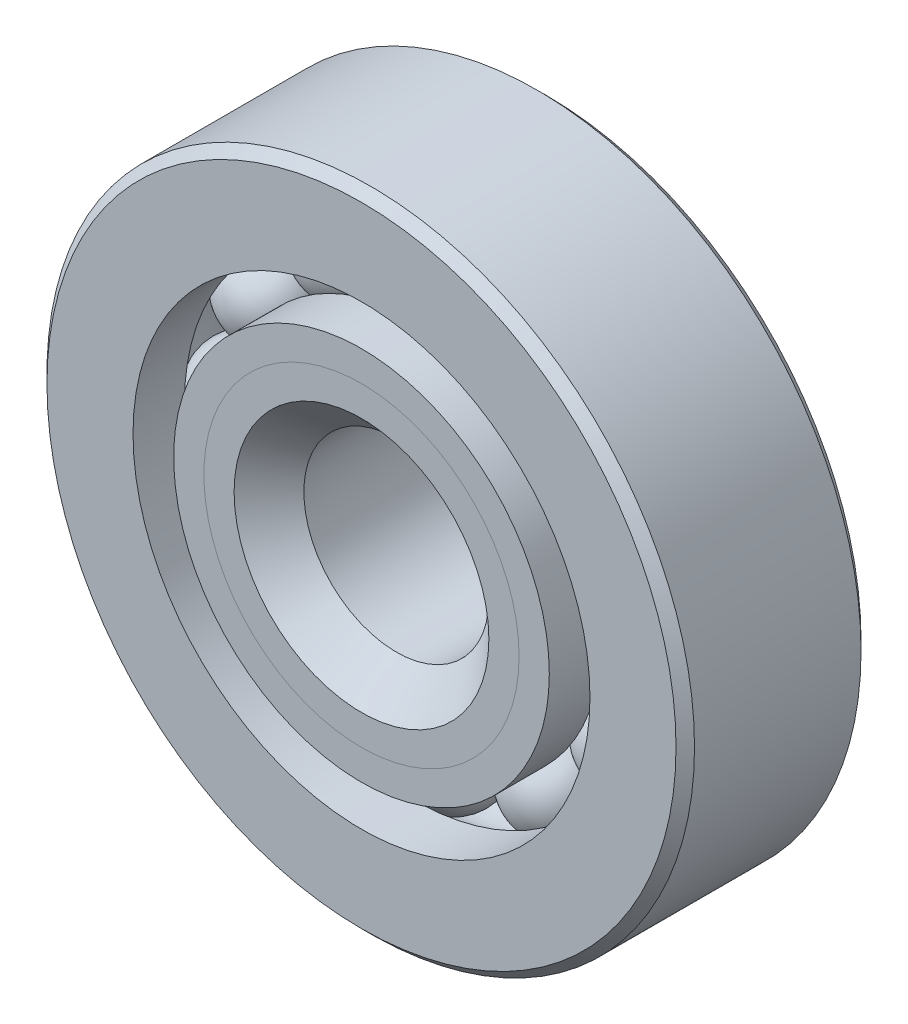
ISO-10303-21;
HEADER;
FILE_DESCRIPTION(('STEP AP214'),'2;1');
FILE_NAME('part.step','',(''),(''),'','','');
FILE_SCHEMA(('AUTOMOTIVE_DESIGN { 1 0 10303 214 1 1 1 1 }'));
ENDSEC;
DATA;
#1=APPLICATION_CONTEXT('core data for automotive mechanical design processes');
#2=APPLICATION_PROTOCOL_DEFINITION('international standard','automotive_design',2000,#1);
#3=PRODUCT_CONTEXT('',#1,'mechanical');
#4=PRODUCT('Part','Part','',(#3));
#5=PRODUCT_RELATED_PRODUCT_CATEGORY('part','',(#4));
#6=PRODUCT_DEFINITION_FORMATION('','',#4);
#7=PRODUCT_DEFINITION_CONTEXT('part definition',#1,'design');
#8=PRODUCT_DEFINITION('design','',#6,#7);
#9=PRODUCT_DEFINITION_SHAPE('','',#8);
#10=(LENGTH_UNIT() NAMED_UNIT(*) SI_UNIT(.MILLI.,.METRE.));
#11=(NAMED_UNIT(*) PLANE_ANGLE_UNIT() SI_UNIT($,.RADIAN.));
#12=(NAMED_UNIT(*) SI_UNIT($,.STERADIAN.) SOLID_ANGLE_UNIT());
#13=UNCERTAINTY_MEASURE_WITH_UNIT(LENGTH_MEASURE(1.E-05),#10,'distance_accuracy_value','');
#14=(GEOMETRIC_REPRESENTATION_CONTEXT(3) GLOBAL_UNCERTAINTY_ASSIGNED_CONTEXT((#13)) GLOBAL_UNIT_ASSIGNED_CONTEXT((#10,
#11,#12)) REPRESENTATION_CONTEXT('',''));
#15=CARTESIAN_POINT('',(0.,0.,0.));
#16=DIRECTION('',(0.,0.,1.));
#17=DIRECTION('',(1.,0.,0.));
#18=AXIS2_PLACEMENT_3D('',#15,#16,#17);
#19=CARTESIAN_POINT('',(-3.57187499999992,6.18666897828513,0.));
#20=DIRECTION('',(0.,0.,1.));
#21=DIRECTION('',(-0.499999999999989,0.866025403784445,0.));
#22=AXIS2_PLACEMENT_3D('',#19,#20,#21);
#23=SPHERICAL_SURFACE('',#22,1.57421805197336);
#24=CARTESIAN_POINT('',(-3.57187499999992,6.18666897828513,1.57421805197336));
#25=VERTEX_POINT('',#24);
#26=VERTEX_LOOP('',#25);
#27=FACE_BOUND('',#26,.T.);
#28=ADVANCED_FACE('F37',(#27),#23,.T.);
#29=CLOSED_SHELL('',(#28));
#30=MANIFOLD_SOLID_BREP('B2',#29);
#31=CARTESIAN_POINT('',(-6.18666897828504,3.57187500000007,0.));
#32=DIRECTION('',(0.,0.,1.));
#33=DIRECTION('',(-0.866025403784433,0.50000000000001,0.));
#34=AXIS2_PLACEMENT_3D('',#31,#32,#33);
#35=SPHERICAL_SURFACE('',#34,1.57421805197336);
#36=CARTESIAN_POINT('',(-6.18666897828504,3.57187500000007,1.57421805197336));
#37=VERTEX_POINT('',#36);
#38=VERTEX_LOOP('',#37);
#39=FACE_BOUND('',#38,.T.);
#40=ADVANCED_FACE('F67',(#39),#35,.T.);
#41=CLOSED_SHELL('',(#40));
#42=MANIFOLD_SOLID_BREP('B6',#41);
#43=CARTESIAN_POINT('',(-7.14375,0.,0.));
#44=DIRECTION('',(0.,0.,1.));
#45=DIRECTION('',(-1.,0.,0.));
#46=AXIS2_PLACEMENT_3D('',#43,#44,#45);
#47=SPHERICAL_SURFACE('',#46,1.57421805197336);
#48=CARTESIAN_POINT('',(-7.14375,0.,1.57421805197336));
#49=VERTEX_POINT('',#48);
#50=VERTEX_LOOP('',#49);
#51=FACE_BOUND('',#50,.T.);
#52=ADVANCED_FACE('F97',(#51),#47,.T.);
#53=CLOSED_SHELL('',(#52));
#54=MANIFOLD_SOLID_BREP('B33',#53);
#55=CARTESIAN_POINT('',(-6.18666897828512,-3.57187499999994,0.));
#56=DIRECTION('',(0.,0.,1.));
#57=DIRECTION('',(-0.866025403784443,-0.499999999999992,0.));
#58=AXIS2_PLACEMENT_3D('',#55,#56,#57);
#59=SPHERICAL_SURFACE('',#58,1.57421805197336);
#60=CARTESIAN_POINT('',(-6.18666897828512,-3.57187499999994,1.57421805197336));
#61=VERTEX_POINT('',#60);
#62=VERTEX_LOOP('',#61);
#63=FACE_BOUND('',#62,.T.);
#64=ADVANCED_FACE('F127',(#63),#59,.T.);
#65=CLOSED_SHELL('',(#64));
#66=MANIFOLD_SOLID_BREP('B63',#65);
#67=CARTESIAN_POINT('',(-3.57187500000005,-6.18666897828506,0.));
#68=DIRECTION('',(0.,0.,1.));
#69=DIRECTION('',(-0.500000000000007,-0.866025403784435,0.));
#70=AXIS2_PLACEMENT_3D('',#67,#68,#69);
#71=SPHERICAL_SURFACE('',#70,1.57421805197336);
#72=CARTESIAN_POINT('',(-3.57187500000005,-6.18666897828506,1.57421805197336));
#73=VERTEX_POINT('',#72);
#74=VERTEX_LOOP('',#73);
#75=FACE_BOUND('',#74,.T.);
#76=ADVANCED_FACE('F157',(#75),#71,.T.);
#77=CLOSED_SHELL('',(#76));
#78=MANIFOLD_SOLID_BREP('B93',#77);
#79=CARTESIAN_POINT('',(0.,-7.14375,0.));
#80=DIRECTION('',(0.,0.,1.));
#81=DIRECTION('',(0.,-1.,0.));
#82=AXIS2_PLACEMENT_3D('',#79,#80,#81);
#83=SPHERICAL_SURFACE('',#82,1.57421805197336);
#84=CARTESIAN_POINT('',(0.,-7.14375,1.57421805197336));
#85=VERTEX_POINT('',#84);
#86=VERTEX_LOOP('',#85);
#87=FACE_BOUND('',#86,.T.);
#88=ADVANCED_FACE('F187',(#87),#83,.T.);
#89=CLOSED_SHELL('',(#88));
#90=MANIFOLD_SOLID_BREP('B123',#89);
#91=CARTESIAN_POINT('',(3.57187499999996,-6.18666897828511,0.));
#92=DIRECTION('',(0.,0.,1.));
#93=DIRECTION('',(0.499999999999995,-0.866025403784442,0.));
#94=AXIS2_PLACEMENT_3D('',#91,#92,#93);
#95=SPHERICAL_SURFACE('',#94,1.57421805197336);
#96=CARTESIAN_POINT('',(3.57187499999996,-6.18666897828511,1.57421805197336));
#97=VERTEX_POINT('',#96);
#98=VERTEX_LOOP('',#97);
#99=FACE_BOUND('',#98,.T.);
#100=ADVANCED_FACE('F217',(#99),#95,.T.);
#101=CLOSED_SHELL('',(#100));
#102=MANIFOLD_SOLID_BREP('B153',#101);
#103=CARTESIAN_POINT('',(6.18666897828507,-3.57187500000003,0.));
#104=DIRECTION('',(0.,0.,1.));
#105=DIRECTION('',(0.866025403784436,-0.500000000000004,0.));
#106=AXIS2_PLACEMENT_3D('',#103,#104,#105);
#107=SPHERICAL_SURFACE('',#106,1.57421805197336);
#108=CARTESIAN_POINT('',(6.18666897828507,-3.57187500000003,1.57421805197336));
#109=VERTEX_POINT('',#108);
#110=VERTEX_LOOP('',#109);
#111=FACE_BOUND('',#110,.T.);
#112=ADVANCED_FACE('F247',(#111),#107,.T.);
#113=CLOSED_SHELL('',(#112));
#114=MANIFOLD_SOLID_BREP('B183',#113);
#115=CARTESIAN_POINT('',(7.14375,0.,0.));
#116=DIRECTION('',(0.,0.,1.));
#117=DIRECTION('',(1.,0.,0.));
#118=AXIS2_PLACEMENT_3D('',#115,#116,#117);
#119=SPHERICAL_SURFACE('',#118,1.57421805197336);
#120=CARTESIAN_POINT('',(7.14375,0.,1.57421805197336));
#121=VERTEX_POINT('',#120);
#122=VERTEX_LOOP('',#121);
#123=FACE_BOUND('',#122,.T.);
#124=ADVANCED_FACE('F277',(#123),#119,.T.);
#125=CLOSED_SHELL('',(#124));
#126=MANIFOLD_SOLID_BREP('B213',#125);
#127=CARTESIAN_POINT('',(6.18666897828509,3.57187499999999,0.));
#128=DIRECTION('',(0.,0.,1.));
#129=DIRECTION('',(0.86602540378444,0.499999999999998,0.));
#130=AXIS2_PLACEMENT_3D('',#127,#128,#129);
#131=SPHERICAL_SURFACE('',#130,1.57421805197336);
#132=CARTESIAN_POINT('',(6.18666897828509,3.57187499999999,1.57421805197336));
#133=VERTEX_POINT('',#132);
#134=VERTEX_LOOP('',#133);
#135=FACE_BOUND('',#134,.T.);
#136=ADVANCED_FACE('F307',(#135),#131,.T.);
#137=CLOSED_SHELL('',(#136));
#138=MANIFOLD_SOLID_BREP('B243',#137);
#139=CARTESIAN_POINT('',(3.57187500000001,6.18666897828508,0.));
#140=DIRECTION('',(0.,0.,1.));
#141=DIRECTION('',(0.500000000000001,0.866025403784438,0.));
#142=AXIS2_PLACEMENT_3D('',#139,#140,#141);
#143=SPHERICAL_SURFACE('',#142,1.57421805197336);
#144=CARTESIAN_POINT('',(3.57187500000001,6.18666897828508,1.57421805197336));
#145=VERTEX_POINT('',#144);
#146=VERTEX_LOOP('',#145);
#147=FACE_BOUND('',#146,.T.);
#148=ADVANCED_FACE('F337',(#147),#143,.T.);
#149=CLOSED_SHELL('',(#148));
#150=MANIFOLD_SOLID_BREP('B273',#149);
#151=CARTESIAN_POINT('',(0.,7.14375,0.));
#152=DIRECTION('',(0.,0.,1.));
#153=DIRECTION('',(0.,1.,0.));
#154=AXIS2_PLACEMENT_3D('',#151,#152,#153);
#155=SPHERICAL_SURFACE('',#154,1.57421805197336);
#156=CARTESIAN_POINT('',(0.,7.14375,1.57421805197336));
#157=VERTEX_POINT('',#156);
#158=VERTEX_LOOP('',#157);
#159=FACE_BOUND('',#158,.T.);
#160=ADVANCED_FACE('F369',(#159),#155,.T.);
#161=CLOSED_SHELL('',(#160));
#162=MANIFOLD_SOLID_BREP('B303',#161);
#163=CARTESIAN_POINT('',(0.,5.40910688810556,3.175));
#164=DIRECTION('',(0.,0.,-1.));
#165=DIRECTION('',(-1.,0.,0.));
#166=AXIS2_PLACEMENT_3D('',#163,#164,#165);
#167=PLANE('',#166);
#168=CARTESIAN_POINT('',(0.,0.,3.175));
#169=DIRECTION('',(0.,0.,1.));
#170=DIRECTION('',(1.,0.,0.));
#171=AXIS2_PLACEMENT_3D('',#168,#169,#170);
#172=CIRCLE('',#171,4.37226597401332);
#173=CARTESIAN_POINT('',(4.37226597401332,0.,3.175));
#174=VERTEX_POINT('',#173);
#175=EDGE_CURVE('E423',#174,#174,#172,.T.);
#176=ORIENTED_EDGE('',*,*,#175,.F.);
#177=EDGE_LOOP('',(#176));
#178=FACE_BOUND('',#177,.T.);
#179=CARTESIAN_POINT('',(0.,0.,3.175));
#180=DIRECTION('',(0.,0.,1.));
#181=DIRECTION('',(1.,0.,0.));
#182=AXIS2_PLACEMENT_3D('',#179,#180,#181);
#183=CIRCLE('',#182,5.40910688810556);
#184=CARTESIAN_POINT('',(5.40910688810556,0.,3.175));
#185=VERTEX_POINT('',#184);
#186=EDGE_CURVE('E368',#185,#185,#183,.T.);
#187=ORIENTED_EDGE('',*,*,#186,.T.);
#188=EDGE_LOOP('',(#187));
#189=FACE_BOUND('',#188,.T.);
#190=ADVANCED_FACE('F389',(#178,#189),#167,.F.);
#191=CARTESIAN_POINT('',(0.,0.,2.13815908590776));
#192=DIRECTION('',(0.,0.,1.));
#193=DIRECTION('',(1.,0.,0.));
#194=AXIS2_PLACEMENT_3D('',#191,#192,#193);
#195=CONICAL_SURFACE('',#194,4.37226597401332,0.785398163397451);
#196=ORIENTED_EDGE('',*,*,#186,.F.);
#197=EDGE_LOOP('',(#196));
#198=FACE_BOUND('',#197,.T.);
#199=CARTESIAN_POINT('',(0.,0.,2.13815908590776));
#200=DIRECTION('',(0.,0.,1.));
#201=DIRECTION('',(1.,0.,0.));
#202=AXIS2_PLACEMENT_3D('',#199,#200,#201);
#203=CIRCLE('',#202,4.37226597401332);
#204=CARTESIAN_POINT('',(4.37226597401332,0.,2.13815908590776));
#205=VERTEX_POINT('',#204);
#206=EDGE_CURVE('E395',#205,#205,#203,.T.);
#207=ORIENTED_EDGE('',*,*,#206,.T.);
#208=EDGE_LOOP('',(#207));
#209=FACE_BOUND('',#208,.T.);
#210=ADVANCED_FACE('F430',(#198,#209),#195,.T.);
#211=CARTESIAN_POINT('',(0.,0.,3.175));
#212=DIRECTION('',(0.,0.,1.));
#213=DIRECTION('',(1.,0.,0.));
#214=AXIS2_PLACEMENT_3D('',#211,#212,#213);
#215=CYLINDRICAL_SURFACE('',#214,4.37226597401332);
#216=ORIENTED_EDGE('',*,*,#206,.F.);
#217=EDGE_LOOP('',(#216));
#218=FACE_BOUND('',#217,.T.);
#219=CARTESIAN_POINT('',(0.,0.,0.));
#220=DIRECTION('',(0.,0.,1.));
#221=DIRECTION('',(1.,0.,0.));
#222=AXIS2_PLACEMENT_3D('',#219,#220,#221);
#223=CIRCLE('',#222,4.37226597401332);
#224=CARTESIAN_POINT('',(4.37226597401332,0.,0.));
#225=VERTEX_POINT('',#224);
#226=EDGE_CURVE('E399',#225,#225,#223,.T.);
#227=ORIENTED_EDGE('',*,*,#226,.T.);
#228=EDGE_LOOP('',(#227));
#229=FACE_BOUND('',#228,.T.);
#230=ADVANCED_FACE('F434',(#218,#229),#215,.T.);
#231=CARTESIAN_POINT('',(0.,4.37226597401332,0.));
#232=DIRECTION('',(0.,0.,-1.));
#233=DIRECTION('',(-1.,0.,0.));
#234=AXIS2_PLACEMENT_3D('',#231,#232,#233);
#235=PLANE('',#234);
#236=ORIENTED_EDGE('',*,*,#226,.F.);
#237=EDGE_LOOP('',(#236));
#238=FACE_BOUND('',#237,.T.);
#239=CARTESIAN_POINT('',(0.,0.,0.));
#240=DIRECTION('',(0.,0.,1.));
#241=DIRECTION('',(1.,0.,0.));
#242=AXIS2_PLACEMENT_3D('',#239,#240,#241);
#243=CIRCLE('',#242,5.56953194802664);
#244=CARTESIAN_POINT('',(5.56953194802664,0.,0.));
#245=VERTEX_POINT('',#244);
#246=EDGE_CURVE('E403',#245,#245,#243,.T.);
#247=ORIENTED_EDGE('',*,*,#246,.T.);
#248=EDGE_LOOP('',(#247));
#249=FACE_BOUND('',#248,.T.);
#250=ADVANCED_FACE('F439',(#238,#249),#235,.F.);
#251=CARTESIAN_POINT('',(0.,0.,0.));
#252=DIRECTION('',(0.,0.,1.));
#253=DIRECTION('',(1.,0.,0.));
#254=AXIS2_PLACEMENT_3D('',#251,#252,#253);
#255=TOROIDAL_SURFACE('',#254,7.14375,1.57421805197336);
#256=ORIENTED_EDGE('',*,*,#246,.F.);
#257=EDGE_LOOP('',(#256));
#258=FACE_BOUND('',#257,.T.);
#259=CARTESIAN_POINT('',(0.,0.,-1.41111111111111));
#260=DIRECTION('',(0.,0.,1.));
#261=DIRECTION('',(1.,0.,0.));
#262=AXIS2_PLACEMENT_3D('',#259,#260,#261);
#263=CIRCLE('',#262,6.4459478021978);
#264=CARTESIAN_POINT('',(6.4459478021978,0.,-1.41111111111111));
#265=VERTEX_POINT('',#264);
#266=EDGE_CURVE('E408',#265,#265,#263,.T.);
#267=ORIENTED_EDGE('',*,*,#266,.T.);
#268=EDGE_LOOP('',(#267));
#269=FACE_BOUND('',#268,.T.);
#270=ADVANCED_FACE('F445',(#258,#269),#255,.F.);
#271=CARTESIAN_POINT('',(0.,0.,3.175));
#272=DIRECTION('',(0.,0.,1.));
#273=DIRECTION('',(1.,0.,0.));
#274=AXIS2_PLACEMENT_3D('',#271,#272,#273);
#275=CYLINDRICAL_SURFACE('',#274,6.4459478021978);
#276=ORIENTED_EDGE('',*,*,#266,.F.);
#277=EDGE_LOOP('',(#276));
#278=FACE_BOUND('',#277,.T.);
#279=CARTESIAN_POINT('',(0.,0.,-3.175));
#280=DIRECTION('',(0.,0.,1.));
#281=DIRECTION('',(1.,0.,0.));
#282=AXIS2_PLACEMENT_3D('',#279,#280,#281);
#283=CIRCLE('',#282,6.4459478021978);
#284=CARTESIAN_POINT('',(6.4459478021978,0.,-3.175));
#285=VERTEX_POINT('',#284);
#286=EDGE_CURVE('E411',#285,#285,#283,.T.);
#287=ORIENTED_EDGE('',*,*,#286,.T.);
#288=EDGE_LOOP('',(#287));
#289=FACE_BOUND('',#288,.T.);
#290=ADVANCED_FACE('F449',(#278,#289),#275,.T.);
#291=CARTESIAN_POINT('',(0.,3.4925,-3.175));
#292=DIRECTION('',(0.,0.,1.));
#293=DIRECTION('',(1.,0.,0.));
#294=AXIS2_PLACEMENT_3D('',#291,#292,#293);
#295=PLANE('',#294);
#296=ORIENTED_EDGE('',*,*,#286,.F.);
#297=EDGE_LOOP('',(#296));
#298=FACE_BOUND('',#297,.T.);
#299=CARTESIAN_POINT('',(0.,0.,-3.17500000000001));
#300=DIRECTION('',(0.,0.,1.));
#301=DIRECTION('',(1.,0.,0.));
#302=AXIS2_PLACEMENT_3D('',#299,#300,#301);
#303=CIRCLE('',#302,3.4925);
#304=CARTESIAN_POINT('',(3.4925,0.,-3.17500000000001));
#305=VERTEX_POINT('',#304);
#306=EDGE_CURVE('E414',#305,#305,#303,.T.);
#307=ORIENTED_EDGE('',*,*,#306,.T.);
#308=EDGE_LOOP('',(#307));
#309=FACE_BOUND('',#308,.T.);
#310=ADVANCED_FACE('F453',(#298,#309),#295,.F.);
#311=CARTESIAN_POINT('',(0.,0.,-2.8575));
#312=DIRECTION('',(0.,0.,-1.));
#313=DIRECTION('',(-1.,0.,0.));
#314=AXIS2_PLACEMENT_3D('',#311,#312,#313);
#315=CONICAL_SURFACE('',#314,3.175,0.785398163397446);
#316=ORIENTED_EDGE('',*,*,#306,.F.);
#317=EDGE_LOOP('',(#316));
#318=FACE_BOUND('',#317,.T.);
#319=CARTESIAN_POINT('',(0.,0.,-2.8575));
#320=DIRECTION('',(0.,0.,1.));
#321=DIRECTION('',(1.,0.,0.));
#322=AXIS2_PLACEMENT_3D('',#319,#320,#321);
#323=CIRCLE('',#322,3.175);
#324=CARTESIAN_POINT('',(3.175,0.,-2.8575));
#325=VERTEX_POINT('',#324);
#326=EDGE_CURVE('E417',#325,#325,#323,.T.);
#327=ORIENTED_EDGE('',*,*,#326,.T.);
#328=EDGE_LOOP('',(#327));
#329=FACE_BOUND('',#328,.T.);
#330=ADVANCED_FACE('F457',(#318,#329),#315,.F.);
#331=CARTESIAN_POINT('',(0.,0.,3.175));
#332=DIRECTION('',(0.,0.,1.));
#333=DIRECTION('',(1.,0.,0.));
#334=AXIS2_PLACEMENT_3D('',#331,#332,#333);
#335=CYLINDRICAL_SURFACE('',#334,3.175);
#336=ORIENTED_EDGE('',*,*,#326,.F.);
#337=EDGE_LOOP('',(#336));
#338=FACE_BOUND('',#337,.T.);
#339=CARTESIAN_POINT('',(0.,0.,1.97773402598669));
#340=DIRECTION('',(0.,0.,1.));
#341=DIRECTION('',(1.,0.,0.));
#342=AXIS2_PLACEMENT_3D('',#339,#340,#341);
#343=CIRCLE('',#342,3.175);
#344=CARTESIAN_POINT('',(3.175,0.,1.97773402598669));
#345=VERTEX_POINT('',#344);
#346=EDGE_CURVE('E420',#345,#345,#343,.T.);
#347=ORIENTED_EDGE('',*,*,#346,.T.);
#348=EDGE_LOOP('',(#347));
#349=FACE_BOUND('',#348,.T.);
#350=ADVANCED_FACE('F461',(#338,#349),#335,.F.);
#351=CARTESIAN_POINT('',(0.,0.,3.175));
#352=DIRECTION('',(0.,0.,1.));
#353=DIRECTION('',(1.,0.,0.));
#354=AXIS2_PLACEMENT_3D('',#351,#352,#353);
#355=CONICAL_SURFACE('',#354,4.37226597401332,0.785398163397451);
#356=ORIENTED_EDGE('',*,*,#346,.F.);
#357=EDGE_LOOP('',(#356));
#358=FACE_BOUND('',#357,.T.);
#359=ORIENTED_EDGE('',*,*,#175,.T.);
#360=EDGE_LOOP('',(#359));
#361=FACE_BOUND('',#360,.T.);
#362=ADVANCED_FACE('F427',(#358,#361),#355,.F.);
#363=CLOSED_SHELL('',(#190,#210,#230,#250,#270,#290,#310,#330,#350,#362));
#364=MANIFOLD_SOLID_BREP('B333',#363);
#365=CARTESIAN_POINT('',(0.,6.44594780219781,3.175));
#366=DIRECTION('',(0.,0.,-1.));
#367=DIRECTION('',(-1.,0.,0.));
#368=AXIS2_PLACEMENT_3D('',#365,#366,#367);
#369=PLANE('',#368);
#370=CARTESIAN_POINT('',(0.,0.,3.175));
#371=DIRECTION('',(0.,0.,1.));
#372=DIRECTION('',(1.,0.,0.));
#373=AXIS2_PLACEMENT_3D('',#370,#371,#372);
#374=CIRCLE('',#373,5.40910688810556);
#375=CARTESIAN_POINT('',(5.40910688810556,0.,3.175));
#376=VERTEX_POINT('',#375);
#377=EDGE_CURVE('E388',#376,#376,#374,.T.);
#378=ORIENTED_EDGE('',*,*,#377,.F.);
#379=EDGE_LOOP('',(#378));
#380=FACE_BOUND('',#379,.T.);
#381=CARTESIAN_POINT('',(0.,0.,3.175));
#382=DIRECTION('',(0.,0.,1.));
#383=DIRECTION('',(1.,0.,0.));
#384=AXIS2_PLACEMENT_3D('',#381,#382,#383);
#385=CIRCLE('',#384,6.44594780219781);
#386=CARTESIAN_POINT('',(6.44594780219781,0.,3.175));
#387=VERTEX_POINT('',#386);
#388=EDGE_CURVE('E569',#387,#387,#385,.T.);
#389=ORIENTED_EDGE('',*,*,#388,.T.);
#390=EDGE_LOOP('',(#389));
#391=FACE_BOUND('',#390,.T.);
#392=ADVANCED_FACE('F547',(#380,#391),#369,.F.);
#393=CARTESIAN_POINT('',(0.,0.,3.175));
#394=DIRECTION('',(0.,0.,1.));
#395=DIRECTION('',(1.,0.,0.));
#396=AXIS2_PLACEMENT_3D('',#393,#394,#395);
#397=CONICAL_SURFACE('',#396,5.40910688810556,0.785398163397451);
#398=CARTESIAN_POINT('',(0.,0.,2.13815908590776));
#399=DIRECTION('',(0.,0.,1.));
#400=DIRECTION('',(1.,0.,0.));
#401=AXIS2_PLACEMENT_3D('',#398,#399,#400);
#402=CIRCLE('',#401,4.37226597401332);
#403=CARTESIAN_POINT('',(4.37226597401332,0.,2.13815908590776));
#404=VERTEX_POINT('',#403);
#405=EDGE_CURVE('E553',#404,#404,#402,.T.);
#406=ORIENTED_EDGE('',*,*,#405,.F.);
#407=EDGE_LOOP('',(#406));
#408=FACE_BOUND('',#407,.T.);
#409=ORIENTED_EDGE('',*,*,#377,.T.);
#410=EDGE_LOOP('',(#409));
#411=FACE_BOUND('',#410,.T.);
#412=ADVANCED_FACE('F594',(#408,#411),#397,.F.);
#413=CARTESIAN_POINT('',(0.,0.,3.175));
#414=DIRECTION('',(0.,0.,1.));
#415=DIRECTION('',(1.,0.,0.));
#416=AXIS2_PLACEMENT_3D('',#413,#414,#415);
#417=CYLINDRICAL_SURFACE('',#416,4.37226597401332);
#418=CARTESIAN_POINT('',(0.,0.,0.));
#419=DIRECTION('',(0.,0.,1.));
#420=DIRECTION('',(1.,0.,0.));
#421=AXIS2_PLACEMENT_3D('',#418,#419,#420);
#422=CIRCLE('',#421,4.37226597401332);
#423=CARTESIAN_POINT('',(4.37226597401332,0.,0.));
#424=VERTEX_POINT('',#423);
#425=EDGE_CURVE('E557',#424,#424,#422,.T.);
#426=ORIENTED_EDGE('',*,*,#425,.F.);
#427=EDGE_LOOP('',(#426));
#428=FACE_BOUND('',#427,.T.);
#429=ORIENTED_EDGE('',*,*,#405,.T.);
#430=EDGE_LOOP('',(#429));
#431=FACE_BOUND('',#430,.T.);
#432=ADVANCED_FACE('F589',(#428,#431),#417,.F.);
#433=CARTESIAN_POINT('',(0.,4.37226597401332,0.));
#434=DIRECTION('',(0.,0.,1.));
#435=DIRECTION('',(1.,0.,0.));
#436=AXIS2_PLACEMENT_3D('',#433,#434,#435);
#437=PLANE('',#436);
#438=CARTESIAN_POINT('',(0.,0.,0.));
#439=DIRECTION('',(0.,0.,1.));
#440=DIRECTION('',(1.,0.,0.));
#441=AXIS2_PLACEMENT_3D('',#438,#439,#440);
#442=CIRCLE('',#441,5.56953194802664);
#443=CARTESIAN_POINT('',(5.56953194802664,0.,0.));
#444=VERTEX_POINT('',#443);
#445=EDGE_CURVE('E561',#444,#444,#442,.T.);
#446=ORIENTED_EDGE('',*,*,#445,.F.);
#447=EDGE_LOOP('',(#446));
#448=FACE_BOUND('',#447,.T.);
#449=ORIENTED_EDGE('',*,*,#425,.T.);
#450=EDGE_LOOP('',(#449));
#451=FACE_BOUND('',#450,.T.);
#452=ADVANCED_FACE('F583',(#448,#451),#437,.F.);
#453=CARTESIAN_POINT('',(0.,0.,0.));
#454=DIRECTION('',(0.,0.,1.));
#455=DIRECTION('',(1.,0.,0.));
#456=AXIS2_PLACEMENT_3D('',#453,#454,#455);
#457=TOROIDAL_SURFACE('',#456,7.14375,1.57421805197336);
#458=CARTESIAN_POINT('',(0.,0.,1.41111111111111));
#459=DIRECTION('',(0.,0.,1.));
#460=DIRECTION('',(1.,0.,0.));
#461=AXIS2_PLACEMENT_3D('',#458,#459,#460);
#462=CIRCLE('',#461,6.44594780219781);
#463=CARTESIAN_POINT('',(6.44594780219781,0.,1.41111111111111));
#464=VERTEX_POINT('',#463);
#465=EDGE_CURVE('E566',#464,#464,#462,.T.);
#466=ORIENTED_EDGE('',*,*,#465,.F.);
#467=EDGE_LOOP('',(#466));
#468=FACE_BOUND('',#467,.T.);
#469=ORIENTED_EDGE('',*,*,#445,.T.);
#470=EDGE_LOOP('',(#469));
#471=FACE_BOUND('',#470,.T.);
#472=ADVANCED_FACE('F577',(#468,#471),#457,.F.);
#473=CARTESIAN_POINT('',(0.,0.,3.175));
#474=DIRECTION('',(0.,0.,1.));
#475=DIRECTION('',(1.,0.,0.));
#476=AXIS2_PLACEMENT_3D('',#473,#474,#475);
#477=CYLINDRICAL_SURFACE('',#476,6.44594780219781);
#478=ORIENTED_EDGE('',*,*,#388,.F.);
#479=EDGE_LOOP('',(#478));
#480=FACE_BOUND('',#479,.T.);
#481=ORIENTED_EDGE('',*,*,#465,.T.);
#482=EDGE_LOOP('',(#481));
#483=FACE_BOUND('',#482,.T.);
#484=ADVANCED_FACE('F574',(#480,#483),#477,.T.);
#485=CLOSED_SHELL('',(#392,#412,#432,#452,#472,#484));
#486=MANIFOLD_SOLID_BREP('B363',#485);
#487=CARTESIAN_POINT('',(0.,0.,2.8575));
#488=DIRECTION('',(0.,0.,-1.));
#489=DIRECTION('',(-1.,0.,0.));
#490=AXIS2_PLACEMENT_3D('',#487,#488,#489);
#491=CONICAL_SURFACE('',#490,11.1125,0.785398163397448);
#492=CARTESIAN_POINT('',(0.,0.,3.175));
#493=DIRECTION('',(0.,0.,1.));
#494=DIRECTION('',(1.,0.,0.));
#495=AXIS2_PLACEMENT_3D('',#492,#493,#494);
#496=CIRCLE('',#495,10.795);
#497=CARTESIAN_POINT('',(10.795,0.,3.175));
#498=VERTEX_POINT('',#497);
#499=EDGE_CURVE('E666',#498,#498,#496,.T.);
#500=ORIENTED_EDGE('',*,*,#499,.F.);
#501=EDGE_LOOP('',(#500));
#502=FACE_BOUND('',#501,.T.);
#503=CARTESIAN_POINT('',(0.,0.,2.8575));
#504=DIRECTION('',(0.,0.,1.));
#505=DIRECTION('',(1.,0.,0.));
#506=AXIS2_PLACEMENT_3D('',#503,#504,#505);
#507=CIRCLE('',#506,11.1125);
#508=CARTESIAN_POINT('',(11.1125,0.,2.8575));
#509=VERTEX_POINT('',#508);
#510=EDGE_CURVE('E546',#509,#509,#507,.T.);
#511=ORIENTED_EDGE('',*,*,#510,.T.);
#512=EDGE_LOOP('',(#511));
#513=FACE_BOUND('',#512,.T.);
#514=ADVANCED_FACE('F638',(#502,#513),#491,.T.);
#515=CARTESIAN_POINT('',(0.,0.,3.175));
#516=DIRECTION('',(0.,0.,1.));
#517=DIRECTION('',(1.,0.,0.));
#518=AXIS2_PLACEMENT_3D('',#515,#516,#517);
#519=CYLINDRICAL_SURFACE('',#518,11.1125);
#520=ORIENTED_EDGE('',*,*,#510,.F.);
#521=EDGE_LOOP('',(#520));
#522=FACE_BOUND('',#521,.T.);
#523=CARTESIAN_POINT('',(0.,0.,-2.8575));
#524=DIRECTION('',(0.,0.,1.));
#525=DIRECTION('',(1.,0.,0.));
#526=AXIS2_PLACEMENT_3D('',#523,#524,#525);
#527=CIRCLE('',#526,11.1125);
#528=CARTESIAN_POINT('',(11.1125,0.,-2.8575));
#529=VERTEX_POINT('',#528);
#530=EDGE_CURVE('E644',#529,#529,#527,.T.);
#531=ORIENTED_EDGE('',*,*,#530,.T.);
#532=EDGE_LOOP('',(#531));
#533=FACE_BOUND('',#532,.T.);
#534=ADVANCED_FACE('F673',(#522,#533),#519,.T.);
#535=CARTESIAN_POINT('',(0.,0.,-3.175));
#536=DIRECTION('',(0.,0.,1.));
#537=DIRECTION('',(1.,0.,0.));
#538=AXIS2_PLACEMENT_3D('',#535,#536,#537);
#539=CONICAL_SURFACE('',#538,10.795,0.785398163397448);
#540=ORIENTED_EDGE('',*,*,#530,.F.);
#541=EDGE_LOOP('',(#540));
#542=FACE_BOUND('',#541,.T.);
#543=CARTESIAN_POINT('',(0.,0.,-3.175));
#544=DIRECTION('',(0.,0.,1.));
#545=DIRECTION('',(1.,0.,0.));
#546=AXIS2_PLACEMENT_3D('',#543,#544,#545);
#547=CIRCLE('',#546,10.795);
#548=CARTESIAN_POINT('',(10.795,0.,-3.175));
#549=VERTEX_POINT('',#548);
#550=EDGE_CURVE('E648',#549,#549,#547,.T.);
#551=ORIENTED_EDGE('',*,*,#550,.T.);
#552=EDGE_LOOP('',(#551));
#553=FACE_BOUND('',#552,.T.);
#554=ADVANCED_FACE('F677',(#542,#553),#539,.T.);
#555=CARTESIAN_POINT('',(0.,10.795,-3.175));
#556=DIRECTION('',(0.,0.,1.));
#557=DIRECTION('',(1.,0.,0.));
#558=AXIS2_PLACEMENT_3D('',#555,#556,#557);
#559=PLANE('',#558);
#560=ORIENTED_EDGE('',*,*,#550,.F.);
#561=EDGE_LOOP('',(#560));
#562=FACE_BOUND('',#561,.T.);
#563=CARTESIAN_POINT('',(0.,0.,-3.17500000000001));
#564=DIRECTION('',(0.,0.,1.));
#565=DIRECTION('',(1.,0.,0.));
#566=AXIS2_PLACEMENT_3D('',#563,#564,#565);
#567=CIRCLE('',#566,7.8415521978022);
#568=CARTESIAN_POINT('',(7.8415521978022,0.,-3.17500000000001));
#569=VERTEX_POINT('',#568);
#570=EDGE_CURVE('E652',#569,#569,#567,.T.);
#571=ORIENTED_EDGE('',*,*,#570,.T.);
#572=EDGE_LOOP('',(#571));
#573=FACE_BOUND('',#572,.T.);
#574=ADVANCED_FACE('F682',(#562,#573),#559,.F.);
#575=CARTESIAN_POINT('',(0.,0.,3.175));
#576=DIRECTION('',(0.,0.,1.));
#577=DIRECTION('',(1.,0.,0.));
#578=AXIS2_PLACEMENT_3D('',#575,#576,#577);
#579=CYLINDRICAL_SURFACE('',#578,7.8415521978022);
#580=ORIENTED_EDGE('',*,*,#570,.F.);
#581=EDGE_LOOP('',(#580));
#582=FACE_BOUND('',#581,.T.);
#583=CARTESIAN_POINT('',(0.,0.,-1.41111111111111));
#584=DIRECTION('',(0.,0.,1.));
#585=DIRECTION('',(1.,0.,0.));
#586=AXIS2_PLACEMENT_3D('',#583,#584,#585);
#587=CIRCLE('',#586,7.8415521978022);
#588=CARTESIAN_POINT('',(7.8415521978022,0.,-1.41111111111111));
#589=VERTEX_POINT('',#588);
#590=EDGE_CURVE('E657',#589,#589,#587,.T.);
#591=ORIENTED_EDGE('',*,*,#590,.T.);
#592=EDGE_LOOP('',(#591));
#593=FACE_BOUND('',#592,.T.);
#594=ADVANCED_FACE('F688',(#582,#593),#579,.F.);
#595=CARTESIAN_POINT('',(0.,0.,0.));
#596=DIRECTION('',(0.,0.,1.));
#597=DIRECTION('',(1.,0.,0.));
#598=AXIS2_PLACEMENT_3D('',#595,#596,#597);
#599=TOROIDAL_SURFACE('',#598,7.14375,1.57421805197336);
#600=ORIENTED_EDGE('',*,*,#590,.F.);
#601=EDGE_LOOP('',(#600));
#602=FACE_BOUND('',#601,.T.);
#603=CARTESIAN_POINT('',(0.,0.,1.41111111111111));
#604=DIRECTION('',(0.,0.,1.));
#605=DIRECTION('',(1.,0.,0.));
#606=AXIS2_PLACEMENT_3D('',#603,#604,#605);
#607=CIRCLE('',#606,7.8415521978022);
#608=CARTESIAN_POINT('',(7.8415521978022,0.,1.41111111111111));
#609=VERTEX_POINT('',#608);
#610=EDGE_CURVE('E660',#609,#609,#607,.T.);
#611=ORIENTED_EDGE('',*,*,#610,.T.);
#612=EDGE_LOOP('',(#611));
#613=FACE_BOUND('',#612,.T.);
#614=ADVANCED_FACE('F692',(#602,#613),#599,.F.);
#615=CARTESIAN_POINT('',(0.,0.,3.175));
#616=DIRECTION('',(0.,0.,1.));
#617=DIRECTION('',(1.,0.,0.));
#618=AXIS2_PLACEMENT_3D('',#615,#616,#617);
#619=CYLINDRICAL_SURFACE('',#618,7.8415521978022);
#620=ORIENTED_EDGE('',*,*,#610,.F.);
#621=EDGE_LOOP('',(#620));
#622=FACE_BOUND('',#621,.T.);
#623=CARTESIAN_POINT('',(0.,0.,3.175));
#624=DIRECTION('',(0.,0.,1.));
#625=DIRECTION('',(1.,0.,0.));
#626=AXIS2_PLACEMENT_3D('',#623,#624,#625);
#627=CIRCLE('',#626,7.8415521978022);
#628=CARTESIAN_POINT('',(7.8415521978022,0.,3.175));
#629=VERTEX_POINT('',#628);
#630=EDGE_CURVE('E663',#629,#629,#627,.T.);
#631=ORIENTED_EDGE('',*,*,#630,.T.);
#632=EDGE_LOOP('',(#631));
#633=FACE_BOUND('',#632,.T.);
#634=ADVANCED_FACE('F696',(#622,#633),#619,.F.);
#635=CARTESIAN_POINT('',(0.,10.795,3.175));
#636=DIRECTION('',(0.,0.,-1.));
#637=DIRECTION('',(-1.,0.,0.));
#638=AXIS2_PLACEMENT_3D('',#635,#636,#637);
#639=PLANE('',#638);
#640=ORIENTED_EDGE('',*,*,#630,.F.);
#641=EDGE_LOOP('',(#640));
#642=FACE_BOUND('',#641,.T.);
#643=ORIENTED_EDGE('',*,*,#499,.T.);
#644=EDGE_LOOP('',(#643));
#645=FACE_BOUND('',#644,.T.);
#646=ADVANCED_FACE('F670',(#642,#645),#639,.F.);
#647=CLOSED_SHELL('',(#514,#534,#554,#574,#594,#614,#634,#646));
#648=MANIFOLD_SOLID_BREP('B383',#647);
#649=ADVANCED_BREP_SHAPE_REPRESENTATION('',(#18,#30,#42,#54,#66,#78,#90,#102,#114,#126,#138,
#150,#162,#364,#486,#648),#14);
#650=SHAPE_DEFINITION_REPRESENTATION(#9,#649);
ENDSEC;
END-ISO-10303-21;
